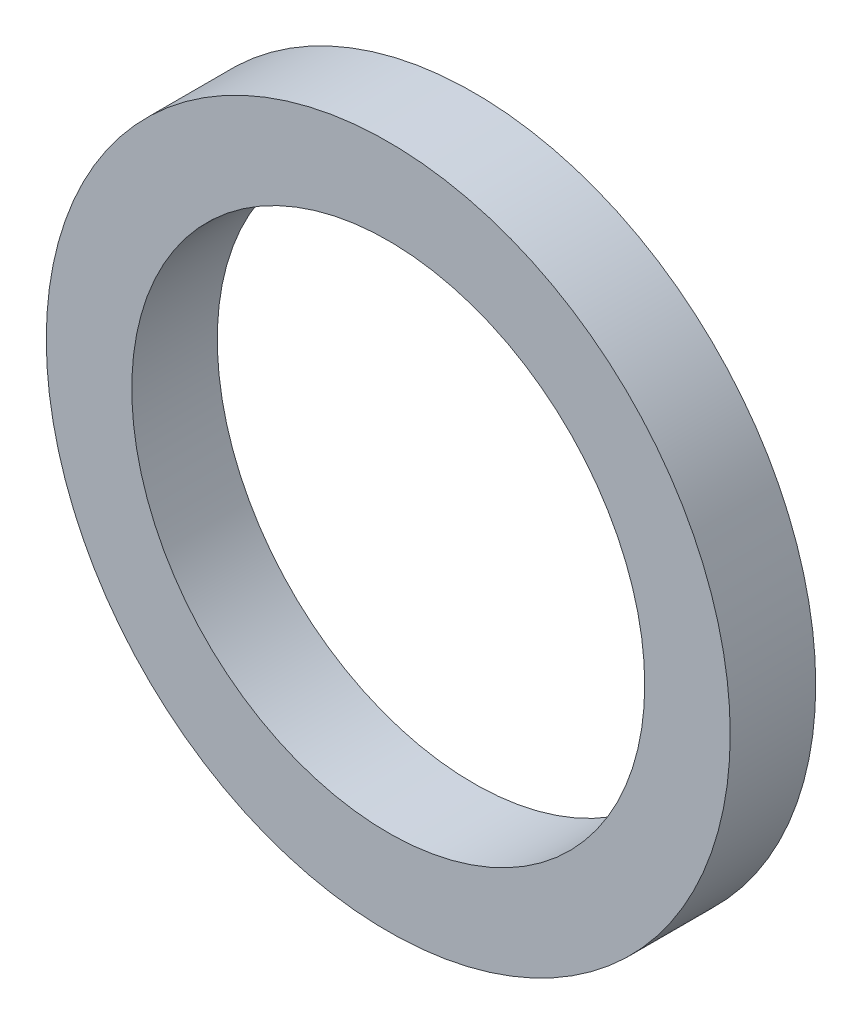
ISO-10303-21;
HEADER;
FILE_DESCRIPTION(('STEP AP214'),'2;1');
FILE_NAME('part.step','',(''),(''),'','','');
FILE_SCHEMA(('AUTOMOTIVE_DESIGN { 1 0 10303 214 1 1 1 1 }'));
ENDSEC;
DATA;
#1=APPLICATION_CONTEXT('core data for automotive mechanical design processes');
#2=APPLICATION_PROTOCOL_DEFINITION('international standard','automotive_design',2000,#1);
#3=PRODUCT_CONTEXT('',#1,'mechanical');
#4=PRODUCT('Part','Part','',(#3));
#5=PRODUCT_RELATED_PRODUCT_CATEGORY('part','',(#4));
#6=PRODUCT_DEFINITION_FORMATION('','',#4);
#7=PRODUCT_DEFINITION_CONTEXT('part definition',#1,'design');
#8=PRODUCT_DEFINITION('design','',#6,#7);
#9=PRODUCT_DEFINITION_SHAPE('','',#8);
#10=(LENGTH_UNIT() NAMED_UNIT(*) SI_UNIT(.MILLI.,.METRE.));
#11=(NAMED_UNIT(*) PLANE_ANGLE_UNIT() SI_UNIT($,.RADIAN.));
#12=(NAMED_UNIT(*) SI_UNIT($,.STERADIAN.) SOLID_ANGLE_UNIT());
#13=UNCERTAINTY_MEASURE_WITH_UNIT(LENGTH_MEASURE(1.E-05),#10,'distance_accuracy_value','');
#14=(GEOMETRIC_REPRESENTATION_CONTEXT(3) GLOBAL_UNCERTAINTY_ASSIGNED_CONTEXT((#13)) GLOBAL_UNIT_ASSIGNED_CONTEXT((#10,
#11,#12)) REPRESENTATION_CONTEXT('',''));
#15=CARTESIAN_POINT('',(0.,0.,0.));
#16=DIRECTION('',(0.,0.,1.));
#17=DIRECTION('',(1.,0.,0.));
#18=AXIS2_PLACEMENT_3D('',#15,#16,#17);
#19=CARTESIAN_POINT('',(0.,0.,1.));
#20=DIRECTION('',(0.,0.,1.));
#21=DIRECTION('',(1.,0.,0.));
#22=AXIS2_PLACEMENT_3D('',#19,#20,#21);
#23=PLANE('',#22);
#24=CARTESIAN_POINT('',(0.,0.,1.));
#25=DIRECTION('',(0.,0.,1.));
#26=DIRECTION('',(1.,0.,0.));
#27=AXIS2_PLACEMENT_3D('',#24,#25,#26);
#28=CIRCLE('',#27,4.);
#29=CARTESIAN_POINT('',(4.,0.,1.));
#30=VERTEX_POINT('',#29);
#31=EDGE_CURVE('E10',#30,#30,#28,.T.);
#32=ORIENTED_EDGE('',*,*,#31,.T.);
#33=EDGE_LOOP('',(#32));
#34=FACE_BOUND('',#33,.T.);
#35=CARTESIAN_POINT('',(0.,0.,1.));
#36=DIRECTION('',(0.,0.,1.));
#37=DIRECTION('',(1.,0.,0.));
#38=AXIS2_PLACEMENT_3D('',#35,#36,#37);
#39=CIRCLE('',#38,3.);
#40=CARTESIAN_POINT('',(3.,0.,1.));
#41=VERTEX_POINT('',#40);
#42=EDGE_CURVE('E43',#41,#41,#39,.T.);
#43=ORIENTED_EDGE('',*,*,#42,.F.);
#44=EDGE_LOOP('',(#43));
#45=FACE_BOUND('',#44,.T.);
#46=ADVANCED_FACE('F32',(#34,#45),#23,.T.);
#47=CARTESIAN_POINT('',(0.,0.,0.));
#48=DIRECTION('',(0.,0.,1.));
#49=DIRECTION('',(1.,0.,0.));
#50=AXIS2_PLACEMENT_3D('',#47,#48,#49);
#51=PLANE('',#50);
#52=CARTESIAN_POINT('',(0.,0.,0.));
#53=DIRECTION('',(0.,0.,1.));
#54=DIRECTION('',(1.,0.,0.));
#55=AXIS2_PLACEMENT_3D('',#52,#53,#54);
#56=CIRCLE('',#55,4.);
#57=CARTESIAN_POINT('',(4.,0.,0.));
#58=VERTEX_POINT('',#57);
#59=EDGE_CURVE('E36',#58,#58,#56,.T.);
#60=ORIENTED_EDGE('',*,*,#59,.F.);
#61=EDGE_LOOP('',(#60));
#62=FACE_BOUND('',#61,.T.);
#63=CARTESIAN_POINT('',(0.,0.,0.));
#64=DIRECTION('',(0.,0.,1.));
#65=DIRECTION('',(1.,0.,0.));
#66=AXIS2_PLACEMENT_3D('',#63,#64,#65);
#67=CIRCLE('',#66,3.);
#68=CARTESIAN_POINT('',(3.,0.,0.));
#69=VERTEX_POINT('',#68);
#70=EDGE_CURVE('E45',#69,#69,#67,.T.);
#71=ORIENTED_EDGE('',*,*,#70,.T.);
#72=EDGE_LOOP('',(#71));
#73=FACE_BOUND('',#72,.T.);
#74=ADVANCED_FACE('F55',(#62,#73),#51,.F.);
#75=CARTESIAN_POINT('',(0.,0.,1.));
#76=DIRECTION('',(0.,0.,-1.));
#77=DIRECTION('',(-1.,0.,0.));
#78=AXIS2_PLACEMENT_3D('',#75,#76,#77);
#79=CYLINDRICAL_SURFACE('',#78,4.);
#80=ORIENTED_EDGE('',*,*,#31,.F.);
#81=EDGE_LOOP('',(#80));
#82=FACE_BOUND('',#81,.T.);
#83=ORIENTED_EDGE('',*,*,#59,.T.);
#84=EDGE_LOOP('',(#83));
#85=FACE_BOUND('',#84,.T.);
#86=ADVANCED_FACE('F34',(#82,#85),#79,.T.);
#87=CARTESIAN_POINT('',(0.,0.,1.));
#88=DIRECTION('',(0.,0.,-1.));
#89=DIRECTION('',(-1.,0.,0.));
#90=AXIS2_PLACEMENT_3D('',#87,#88,#89);
#91=CYLINDRICAL_SURFACE('',#90,3.);
#92=ORIENTED_EDGE('',*,*,#42,.T.);
#93=EDGE_LOOP('',(#92));
#94=FACE_BOUND('',#93,.T.);
#95=ORIENTED_EDGE('',*,*,#70,.F.);
#96=EDGE_LOOP('',(#95));
#97=FACE_BOUND('',#96,.T.);
#98=ADVANCED_FACE('F51',(#94,#97),#91,.F.);
#99=CLOSED_SHELL('',(#46,#74,#86,#98));
#100=MANIFOLD_SOLID_BREP('B2',#99);
#101=ADVANCED_BREP_SHAPE_REPRESENTATION('',(#18,#100),#14);
#102=SHAPE_DEFINITION_REPRESENTATION(#9,#101);
ENDSEC;
END-ISO-10303-21;
